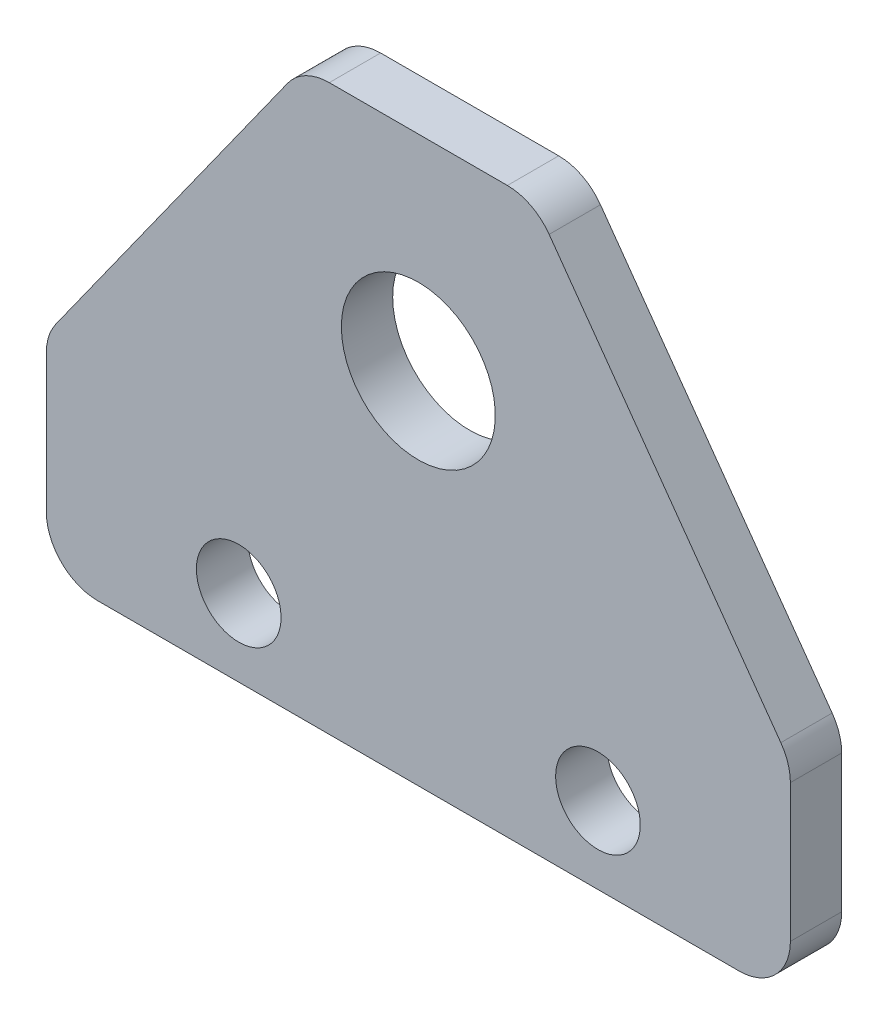
ISO-10303-21;
HEADER;
FILE_DESCRIPTION(('STEP AP214'),'2;1');
FILE_NAME('part.step','',(''),(''),'','','');
FILE_SCHEMA(('AUTOMOTIVE_DESIGN { 1 0 10303 214 1 1 1 1 }'));
ENDSEC;
DATA;
#1=APPLICATION_CONTEXT('core data for automotive mechanical design processes');
#2=APPLICATION_PROTOCOL_DEFINITION('international standard','automotive_design',2000,#1);
#3=PRODUCT_CONTEXT('',#1,'mechanical');
#4=PRODUCT('Part','Part','',(#3));
#5=PRODUCT_RELATED_PRODUCT_CATEGORY('part','',(#4));
#6=PRODUCT_DEFINITION_FORMATION('','',#4);
#7=PRODUCT_DEFINITION_CONTEXT('part definition',#1,'design');
#8=PRODUCT_DEFINITION('design','',#6,#7);
#9=PRODUCT_DEFINITION_SHAPE('','',#8);
#10=(LENGTH_UNIT() NAMED_UNIT(*) SI_UNIT(.MILLI.,.METRE.));
#11=(NAMED_UNIT(*) PLANE_ANGLE_UNIT() SI_UNIT($,.RADIAN.));
#12=(NAMED_UNIT(*) SI_UNIT($,.STERADIAN.) SOLID_ANGLE_UNIT());
#13=UNCERTAINTY_MEASURE_WITH_UNIT(LENGTH_MEASURE(1.E-05),#10,'distance_accuracy_value','');
#14=(GEOMETRIC_REPRESENTATION_CONTEXT(3) GLOBAL_UNCERTAINTY_ASSIGNED_CONTEXT((#13)) GLOBAL_UNIT_ASSIGNED_CONTEXT((#10,
#11,#12)) REPRESENTATION_CONTEXT('',''));
#15=CARTESIAN_POINT('',(0.,0.,0.));
#16=DIRECTION('',(0.,0.,1.));
#17=DIRECTION('',(1.,0.,0.));
#18=AXIS2_PLACEMENT_3D('',#15,#16,#17);
#19=CARTESIAN_POINT('',(72.5,44.0077857544961,10.));
#20=DIRECTION('',(0.,0.,1.));
#21=DIRECTION('',(1.,0.,0.));
#22=AXIS2_PLACEMENT_3D('',#19,#20,#21);
#23=PLANE('',#22);
#24=CARTESIAN_POINT('',(72.5,70.,10.));
#25=DIRECTION('',(0.,0.,-1.));
#26=DIRECTION('',(-1.,0.,0.));
#27=AXIS2_PLACEMENT_3D('',#24,#25,#26);
#28=CIRCLE('',#27,15.);
#29=CARTESIAN_POINT('',(57.5,70.,10.));
#30=VERTEX_POINT('',#29);
#31=EDGE_CURVE('E175',#30,#30,#28,.T.);
#32=ORIENTED_EDGE('',*,*,#31,.T.);
#33=EDGE_LOOP('',(#32));
#34=FACE_BOUND('',#33,.T.);
#35=CARTESIAN_POINT('',(37.5,15.,10.));
#36=DIRECTION('',(0.,0.,-1.));
#37=DIRECTION('',(-1.,0.,0.));
#38=AXIS2_PLACEMENT_3D('',#35,#36,#37);
#39=CIRCLE('',#38,8.25);
#40=CARTESIAN_POINT('',(29.25,15.,10.));
#41=VERTEX_POINT('',#40);
#42=EDGE_CURVE('E178',#41,#41,#39,.T.);
#43=ORIENTED_EDGE('',*,*,#42,.T.);
#44=EDGE_LOOP('',(#43));
#45=FACE_BOUND('',#44,.T.);
#46=CARTESIAN_POINT('',(107.5,15.,10.));
#47=DIRECTION('',(0.,0.,-1.));
#48=DIRECTION('',(-1.,0.,0.));
#49=AXIS2_PLACEMENT_3D('',#46,#47,#48);
#50=CIRCLE('',#49,8.25);
#51=CARTESIAN_POINT('',(99.25,15.,10.));
#52=VERTEX_POINT('',#51);
#53=EDGE_CURVE('E181',#52,#52,#50,.T.);
#54=ORIENTED_EDGE('',*,*,#53,.T.);
#55=EDGE_LOOP('',(#54));
#56=FACE_BOUND('',#55,.T.);
#57=CARTESIAN_POINT('',(9.99999999999999,36.7953494659147,10.));
#58=DIRECTION('',(0.,0.,1.));
#59=DIRECTION('',(1.,0.,0.));
#60=AXIS2_PLACEMENT_3D('',#57,#58,#59);
#61=CIRCLE('',#60,10.);
#62=CARTESIAN_POINT('',(0.,36.7953494659147,10.));
#63=VERTEX_POINT('',#62);
#64=CARTESIAN_POINT('',(1.86266528793265,42.6077314031057,10.));
#65=VERTEX_POINT('',#64);
#66=EDGE_CURVE('E186',#63,#65,#61,.F.);
#67=ORIENTED_EDGE('',*,*,#66,.F.);
#68=DIRECTION('',(0.,-1.,0.));
#69=VECTOR('',#68,1.);
#70=CARTESIAN_POINT('',(0.,40.,10.));
#71=LINE('',#70,#69);
#72=CARTESIAN_POINT('',(0.,10.,10.));
#73=VERTEX_POINT('',#72);
#74=EDGE_CURVE('E130',#73,#63,#71,.F.);
#75=ORIENTED_EDGE('',*,*,#74,.F.);
#76=CARTESIAN_POINT('',(10.,10.,10.));
#77=DIRECTION('',(0.,0.,1.));
#78=DIRECTION('',(1.,0.,0.));
#79=AXIS2_PLACEMENT_3D('',#76,#77,#78);
#80=CIRCLE('',#79,10.);
#81=CARTESIAN_POINT('',(10.,0.,10.));
#82=VERTEX_POINT('',#81);
#83=EDGE_CURVE('E117',#82,#73,#80,.F.);
#84=ORIENTED_EDGE('',*,*,#83,.F.);
#85=DIRECTION('',(1.,0.,0.));
#86=VECTOR('',#85,1.);
#87=CARTESIAN_POINT('',(0.,0.,10.));
#88=LINE('',#87,#86);
#89=CARTESIAN_POINT('',(135.,0.,10.));
#90=VERTEX_POINT('',#89);
#91=EDGE_CURVE('E113',#90,#82,#88,.F.);
#92=ORIENTED_EDGE('',*,*,#91,.F.);
#93=CARTESIAN_POINT('',(135.,10.,10.));
#94=DIRECTION('',(0.,0.,1.));
#95=DIRECTION('',(1.,0.,0.));
#96=AXIS2_PLACEMENT_3D('',#93,#94,#95);
#97=CIRCLE('',#96,10.);
#98=CARTESIAN_POINT('',(145.,10.,10.));
#99=VERTEX_POINT('',#98);
#100=EDGE_CURVE('E20',#99,#90,#97,.F.);
#101=ORIENTED_EDGE('',*,*,#100,.F.);
#102=DIRECTION('',(0.,1.,0.));
#103=VECTOR('',#102,1.);
#104=CARTESIAN_POINT('',(145.,0.,10.));
#105=LINE('',#104,#103);
#106=CARTESIAN_POINT('',(145.,36.7953494659147,10.));
#107=VERTEX_POINT('',#106);
#108=EDGE_CURVE('E126',#107,#99,#105,.F.);
#109=ORIENTED_EDGE('',*,*,#108,.F.);
#110=CARTESIAN_POINT('',(135.,36.7953494659147,10.));
#111=DIRECTION('',(0.,0.,1.));
#112=DIRECTION('',(1.,0.,0.));
#113=AXIS2_PLACEMENT_3D('',#110,#111,#112);
#114=CIRCLE('',#113,10.);
#115=CARTESIAN_POINT('',(143.137334712067,42.6077314031058,10.));
#116=VERTEX_POINT('',#115);
#117=EDGE_CURVE('E147',#116,#107,#114,.F.);
#118=ORIENTED_EDGE('',*,*,#117,.F.);
#119=DIRECTION('',(-0.581238193719096,0.813733471206735,0.));
#120=VECTOR('',#119,1.);
#121=CARTESIAN_POINT('',(145.,40.,10.));
#122=LINE('',#121,#120);
#123=CARTESIAN_POINT('',(97.9911557591493,105.812381937191,10.));
#124=VERTEX_POINT('',#123);
#125=EDGE_CURVE('E142',#124,#116,#122,.F.);
#126=ORIENTED_EDGE('',*,*,#125,.F.);
#127=CARTESIAN_POINT('',(89.8538210470819,100.,10.));
#128=DIRECTION('',(0.,0.,1.));
#129=DIRECTION('',(1.,0.,0.));
#130=AXIS2_PLACEMENT_3D('',#127,#128,#129);
#131=CIRCLE('',#130,10.);
#132=CARTESIAN_POINT('',(89.8538210470819,110.,10.));
#133=VERTEX_POINT('',#132);
#134=EDGE_CURVE('E145',#133,#124,#131,.F.);
#135=ORIENTED_EDGE('',*,*,#134,.F.);
#136=DIRECTION('',(1.,0.,0.));
#137=VECTOR('',#136,1.);
#138=CARTESIAN_POINT('',(95.,110.,10.));
#139=LINE('',#138,#137);
#140=CARTESIAN_POINT('',(55.146178952918,110.,10.));
#141=VERTEX_POINT('',#140);
#142=EDGE_CURVE('E138',#141,#133,#139,.T.);
#143=ORIENTED_EDGE('',*,*,#142,.F.);
#144=CARTESIAN_POINT('',(55.146178952918,100.,10.));
#145=DIRECTION('',(0.,0.,1.));
#146=DIRECTION('',(1.,0.,0.));
#147=AXIS2_PLACEMENT_3D('',#144,#145,#146);
#148=CIRCLE('',#147,10.);
#149=CARTESIAN_POINT('',(47.0088442408507,105.812381937191,10.));
#150=VERTEX_POINT('',#149);
#151=EDGE_CURVE('E188',#150,#141,#148,.F.);
#152=ORIENTED_EDGE('',*,*,#151,.F.);
#153=DIRECTION('',(-0.581238193719096,-0.813733471206735,0.));
#154=VECTOR('',#153,1.);
#155=CARTESIAN_POINT('',(50.,110.,10.));
#156=LINE('',#155,#154);
#157=EDGE_CURVE('E134',#65,#150,#156,.F.);
#158=ORIENTED_EDGE('',*,*,#157,.F.);
#159=EDGE_LOOP('',(#67,#75,#84,#92,#101,#109,#118,#126,#135,#143,#152,#158));
#160=FACE_BOUND('',#159,.T.);
#161=ADVANCED_FACE('F17',(#34,#45,#56,#160),#23,.T.);
#162=CARTESIAN_POINT('',(0.,0.,0.));
#163=DIRECTION('',(0.,-1.,0.));
#164=DIRECTION('',(0.,0.,-1.));
#165=AXIS2_PLACEMENT_3D('',#162,#163,#164);
#166=PLANE('',#165);
#167=DIRECTION('',(0.,0.,1.));
#168=VECTOR('',#167,1.);
#169=CARTESIAN_POINT('',(135.,0.,0.));
#170=LINE('',#169,#168);
#171=CARTESIAN_POINT('',(135.,0.,0.));
#172=VERTEX_POINT('',#171);
#173=EDGE_CURVE('E110',#90,#172,#170,.F.);
#174=ORIENTED_EDGE('',*,*,#173,.F.);
#175=ORIENTED_EDGE('',*,*,#91,.T.);
#176=DIRECTION('',(0.,0.,1.));
#177=VECTOR('',#176,1.);
#178=CARTESIAN_POINT('',(10.,0.,0.));
#179=LINE('',#178,#177);
#180=CARTESIAN_POINT('',(10.,0.,0.));
#181=VERTEX_POINT('',#180);
#182=EDGE_CURVE('E184',#181,#82,#179,.T.);
#183=ORIENTED_EDGE('',*,*,#182,.F.);
#184=DIRECTION('',(1.,0.,0.));
#185=VECTOR('',#184,1.);
#186=CARTESIAN_POINT('',(72.5,0.,0.));
#187=LINE('',#186,#185);
#188=EDGE_CURVE('E124',#181,#172,#187,.T.);
#189=ORIENTED_EDGE('',*,*,#188,.T.);
#190=EDGE_LOOP('',(#174,#175,#183,#189));
#191=FACE_BOUND('',#190,.T.);
#192=ADVANCED_FACE('F123',(#191),#166,.T.);
#193=CARTESIAN_POINT('',(135.,10.,0.));
#194=DIRECTION('',(0.,0.,1.));
#195=DIRECTION('',(1.,0.,0.));
#196=AXIS2_PLACEMENT_3D('',#193,#194,#195);
#197=CYLINDRICAL_SURFACE('',#196,10.);
#198=CARTESIAN_POINT('',(135.,10.,0.));
#199=DIRECTION('',(0.,0.,1.));
#200=DIRECTION('',(1.,0.,0.));
#201=AXIS2_PLACEMENT_3D('',#198,#199,#200);
#202=CIRCLE('',#201,10.);
#203=CARTESIAN_POINT('',(145.,10.,0.));
#204=VERTEX_POINT('',#203);
#205=EDGE_CURVE('E173',#172,#204,#202,.T.);
#206=ORIENTED_EDGE('',*,*,#205,.T.);
#207=DIRECTION('',(0.,0.,-1.));
#208=VECTOR('',#207,1.);
#209=CARTESIAN_POINT('',(145.,10.,0.));
#210=LINE('',#209,#208);
#211=EDGE_CURVE('E112',#99,#204,#210,.T.);
#212=ORIENTED_EDGE('',*,*,#211,.F.);
#213=ORIENTED_EDGE('',*,*,#100,.T.);
#214=ORIENTED_EDGE('',*,*,#173,.T.);
#215=EDGE_LOOP('',(#206,#212,#213,#214));
#216=FACE_BOUND('',#215,.T.);
#217=ADVANCED_FACE('F108',(#216),#197,.T.);
#218=CARTESIAN_POINT('',(145.,0.,0.));
#219=DIRECTION('',(1.,0.,0.));
#220=DIRECTION('',(0.,0.,-1.));
#221=AXIS2_PLACEMENT_3D('',#218,#219,#220);
#222=PLANE('',#221);
#223=DIRECTION('',(0.,0.,1.));
#224=VECTOR('',#223,1.);
#225=CARTESIAN_POINT('',(145.,36.7953494659147,0.));
#226=LINE('',#225,#224);
#227=CARTESIAN_POINT('',(145.,36.7953494659147,0.));
#228=VERTEX_POINT('',#227);
#229=EDGE_CURVE('E190',#107,#228,#226,.F.);
#230=ORIENTED_EDGE('',*,*,#229,.F.);
#231=ORIENTED_EDGE('',*,*,#108,.T.);
#232=ORIENTED_EDGE('',*,*,#211,.T.);
#233=DIRECTION('',(0.,1.,0.));
#234=VECTOR('',#233,1.);
#235=CARTESIAN_POINT('',(145.,44.0077857544961,0.));
#236=LINE('',#235,#234);
#237=EDGE_CURVE('E172',#204,#228,#236,.T.);
#238=ORIENTED_EDGE('',*,*,#237,.T.);
#239=EDGE_LOOP('',(#230,#231,#232,#238));
#240=FACE_BOUND('',#239,.T.);
#241=ADVANCED_FACE('F252',(#240),#222,.T.);
#242=CARTESIAN_POINT('',(135.,36.7953494659147,0.));
#243=DIRECTION('',(0.,0.,1.));
#244=DIRECTION('',(1.,0.,0.));
#245=AXIS2_PLACEMENT_3D('',#242,#243,#244);
#246=CYLINDRICAL_SURFACE('',#245,10.);
#247=CARTESIAN_POINT('',(135.,36.7953494659147,0.));
#248=DIRECTION('',(0.,0.,1.));
#249=DIRECTION('',(1.,0.,0.));
#250=AXIS2_PLACEMENT_3D('',#247,#248,#249);
#251=CIRCLE('',#250,10.);
#252=CARTESIAN_POINT('',(143.137334712067,42.6077314031057,0.));
#253=VERTEX_POINT('',#252);
#254=EDGE_CURVE('E169',#228,#253,#251,.T.);
#255=ORIENTED_EDGE('',*,*,#254,.T.);
#256=DIRECTION('',(0.,0.,1.));
#257=VECTOR('',#256,1.);
#258=CARTESIAN_POINT('',(143.137334712067,42.6077314031059,0.));
#259=LINE('',#258,#257);
#260=EDGE_CURVE('E146',#116,#253,#259,.F.);
#261=ORIENTED_EDGE('',*,*,#260,.F.);
#262=ORIENTED_EDGE('',*,*,#117,.T.);
#263=ORIENTED_EDGE('',*,*,#229,.T.);
#264=EDGE_LOOP('',(#255,#261,#262,#263));
#265=FACE_BOUND('',#264,.T.);
#266=ADVANCED_FACE('F250',(#265),#246,.T.);
#267=CARTESIAN_POINT('',(145.,40.,0.));
#268=DIRECTION('',(0.813733471206735,0.581238193719096,0.));
#269=DIRECTION('',(-0.581238193719096,0.813733471206735,0.));
#270=AXIS2_PLACEMENT_3D('',#267,#268,#269);
#271=PLANE('',#270);
#272=DIRECTION('',(0.,0.,1.));
#273=VECTOR('',#272,1.);
#274=CARTESIAN_POINT('',(97.9911557591492,105.812381937191,0.));
#275=LINE('',#274,#273);
#276=CARTESIAN_POINT('',(97.9911557591493,105.812381937191,0.));
#277=VERTEX_POINT('',#276);
#278=EDGE_CURVE('E141',#124,#277,#275,.F.);
#279=ORIENTED_EDGE('',*,*,#278,.F.);
#280=ORIENTED_EDGE('',*,*,#125,.T.);
#281=ORIENTED_EDGE('',*,*,#260,.T.);
#282=DIRECTION('',(-0.581238193719093,0.813733471206737,0.));
#283=VECTOR('',#282,1.);
#284=CARTESIAN_POINT('',(143.137334712067,42.6077314031057,0.));
#285=LINE('',#284,#283);
#286=EDGE_CURVE('E168',#253,#277,#285,.T.);
#287=ORIENTED_EDGE('',*,*,#286,.T.);
#288=EDGE_LOOP('',(#279,#280,#281,#287));
#289=FACE_BOUND('',#288,.T.);
#290=ADVANCED_FACE('F248',(#289),#271,.T.);
#291=CARTESIAN_POINT('',(89.8538210470819,100.,0.));
#292=DIRECTION('',(0.,0.,1.));
#293=DIRECTION('',(1.,0.,0.));
#294=AXIS2_PLACEMENT_3D('',#291,#292,#293);
#295=CYLINDRICAL_SURFACE('',#294,10.);
#296=CARTESIAN_POINT('',(89.8538210470819,100.,0.));
#297=DIRECTION('',(0.,0.,1.));
#298=DIRECTION('',(1.,0.,0.));
#299=AXIS2_PLACEMENT_3D('',#296,#297,#298);
#300=CIRCLE('',#299,10.);
#301=CARTESIAN_POINT('',(89.8538210470819,110.,0.));
#302=VERTEX_POINT('',#301);
#303=EDGE_CURVE('E165',#277,#302,#300,.T.);
#304=ORIENTED_EDGE('',*,*,#303,.T.);
#305=DIRECTION('',(0.,0.,1.));
#306=VECTOR('',#305,1.);
#307=CARTESIAN_POINT('',(89.8538210470819,110.,0.));
#308=LINE('',#307,#306);
#309=EDGE_CURVE('E140',#133,#302,#308,.F.);
#310=ORIENTED_EDGE('',*,*,#309,.F.);
#311=ORIENTED_EDGE('',*,*,#134,.T.);
#312=ORIENTED_EDGE('',*,*,#278,.T.);
#313=EDGE_LOOP('',(#304,#310,#311,#312));
#314=FACE_BOUND('',#313,.T.);
#315=ADVANCED_FACE('F244',(#314),#295,.T.);
#316=CARTESIAN_POINT('',(95.,110.,0.));
#317=DIRECTION('',(0.,1.,0.));
#318=DIRECTION('',(0.,0.,1.));
#319=AXIS2_PLACEMENT_3D('',#316,#317,#318);
#320=PLANE('',#319);
#321=ORIENTED_EDGE('',*,*,#309,.T.);
#322=DIRECTION('',(1.,0.,0.));
#323=VECTOR('',#322,1.);
#324=CARTESIAN_POINT('',(72.5,110.,0.));
#325=LINE('',#324,#323);
#326=CARTESIAN_POINT('',(55.146178952918,110.,0.));
#327=VERTEX_POINT('',#326);
#328=EDGE_CURVE('E164',#302,#327,#325,.F.);
#329=ORIENTED_EDGE('',*,*,#328,.T.);
#330=DIRECTION('',(0.,0.,1.));
#331=VECTOR('',#330,1.);
#332=CARTESIAN_POINT('',(55.146178952918,110.,0.));
#333=LINE('',#332,#331);
#334=EDGE_CURVE('E137',#141,#327,#333,.F.);
#335=ORIENTED_EDGE('',*,*,#334,.F.);
#336=ORIENTED_EDGE('',*,*,#142,.T.);
#337=EDGE_LOOP('',(#321,#329,#335,#336));
#338=FACE_BOUND('',#337,.T.);
#339=ADVANCED_FACE('F238',(#338),#320,.T.);
#340=CARTESIAN_POINT('',(55.146178952918,100.,0.));
#341=DIRECTION('',(0.,0.,1.));
#342=DIRECTION('',(1.,0.,0.));
#343=AXIS2_PLACEMENT_3D('',#340,#341,#342);
#344=CYLINDRICAL_SURFACE('',#343,10.);
#345=CARTESIAN_POINT('',(55.146178952918,100.,0.));
#346=DIRECTION('',(0.,0.,1.));
#347=DIRECTION('',(1.,0.,0.));
#348=AXIS2_PLACEMENT_3D('',#345,#346,#347);
#349=CIRCLE('',#348,10.);
#350=CARTESIAN_POINT('',(47.0088442408506,105.812381937191,0.));
#351=VERTEX_POINT('',#350);
#352=EDGE_CURVE('E161',#327,#351,#349,.T.);
#353=ORIENTED_EDGE('',*,*,#352,.T.);
#354=DIRECTION('',(0.,0.,1.));
#355=VECTOR('',#354,1.);
#356=CARTESIAN_POINT('',(47.0088442408507,105.812381937191,0.));
#357=LINE('',#356,#355);
#358=EDGE_CURVE('E136',#150,#351,#357,.F.);
#359=ORIENTED_EDGE('',*,*,#358,.F.);
#360=ORIENTED_EDGE('',*,*,#151,.T.);
#361=ORIENTED_EDGE('',*,*,#334,.T.);
#362=EDGE_LOOP('',(#353,#359,#360,#361));
#363=FACE_BOUND('',#362,.T.);
#364=ADVANCED_FACE('F234',(#363),#344,.T.);
#365=CARTESIAN_POINT('',(50.,110.,0.));
#366=DIRECTION('',(-0.813733471206735,0.581238193719096,0.));
#367=DIRECTION('',(-0.581238193719096,-0.813733471206735,0.));
#368=AXIS2_PLACEMENT_3D('',#365,#366,#367);
#369=PLANE('',#368);
#370=ORIENTED_EDGE('',*,*,#358,.T.);
#371=DIRECTION('',(-0.581238193719095,-0.813733471206736,0.));
#372=VECTOR('',#371,1.);
#373=CARTESIAN_POINT('',(47.0088442408506,105.812381937191,0.));
#374=LINE('',#373,#372);
#375=CARTESIAN_POINT('',(1.86266528793264,42.6077314031057,0.));
#376=VERTEX_POINT('',#375);
#377=EDGE_CURVE('E160',#351,#376,#374,.T.);
#378=ORIENTED_EDGE('',*,*,#377,.T.);
#379=DIRECTION('',(0.,0.,1.));
#380=VECTOR('',#379,1.);
#381=CARTESIAN_POINT('',(1.86266528793265,42.6077314031057,0.));
#382=LINE('',#381,#380);
#383=EDGE_CURVE('E133',#65,#376,#382,.F.);
#384=ORIENTED_EDGE('',*,*,#383,.F.);
#385=ORIENTED_EDGE('',*,*,#157,.T.);
#386=EDGE_LOOP('',(#370,#378,#384,#385));
#387=FACE_BOUND('',#386,.T.);
#388=ADVANCED_FACE('F228',(#387),#369,.T.);
#389=CARTESIAN_POINT('',(9.99999999999999,36.7953494659147,0.));
#390=DIRECTION('',(0.,0.,1.));
#391=DIRECTION('',(1.,0.,0.));
#392=AXIS2_PLACEMENT_3D('',#389,#390,#391);
#393=CYLINDRICAL_SURFACE('',#392,10.);
#394=CARTESIAN_POINT('',(9.99999999999999,36.7953494659147,0.));
#395=DIRECTION('',(0.,0.,1.));
#396=DIRECTION('',(1.,0.,0.));
#397=AXIS2_PLACEMENT_3D('',#394,#395,#396);
#398=CIRCLE('',#397,10.);
#399=CARTESIAN_POINT('',(0.,36.7953494659147,0.));
#400=VERTEX_POINT('',#399);
#401=EDGE_CURVE('E157',#376,#400,#398,.T.);
#402=ORIENTED_EDGE('',*,*,#401,.T.);
#403=DIRECTION('',(0.,0.,1.));
#404=VECTOR('',#403,1.);
#405=CARTESIAN_POINT('',(0.,36.7953494659147,0.));
#406=LINE('',#405,#404);
#407=EDGE_CURVE('E132',#63,#400,#406,.F.);
#408=ORIENTED_EDGE('',*,*,#407,.F.);
#409=ORIENTED_EDGE('',*,*,#66,.T.);
#410=ORIENTED_EDGE('',*,*,#383,.T.);
#411=EDGE_LOOP('',(#402,#408,#409,#410));
#412=FACE_BOUND('',#411,.T.);
#413=ADVANCED_FACE('F224',(#412),#393,.T.);
#414=CARTESIAN_POINT('',(0.,40.,0.));
#415=DIRECTION('',(-1.,0.,0.));
#416=DIRECTION('',(0.,-1.,0.));
#417=AXIS2_PLACEMENT_3D('',#414,#415,#416);
#418=PLANE('',#417);
#419=ORIENTED_EDGE('',*,*,#407,.T.);
#420=DIRECTION('',(0.,1.,0.));
#421=VECTOR('',#420,1.);
#422=CARTESIAN_POINT('',(0.,44.0077857544961,0.));
#423=LINE('',#422,#421);
#424=CARTESIAN_POINT('',(0.,10.,0.));
#425=VERTEX_POINT('',#424);
#426=EDGE_CURVE('E156',#400,#425,#423,.F.);
#427=ORIENTED_EDGE('',*,*,#426,.T.);
#428=DIRECTION('',(0.,0.,1.));
#429=VECTOR('',#428,1.);
#430=CARTESIAN_POINT('',(0.,10.,0.));
#431=LINE('',#430,#429);
#432=EDGE_CURVE('E35',#73,#425,#431,.F.);
#433=ORIENTED_EDGE('',*,*,#432,.F.);
#434=ORIENTED_EDGE('',*,*,#74,.T.);
#435=EDGE_LOOP('',(#419,#427,#433,#434));
#436=FACE_BOUND('',#435,.T.);
#437=ADVANCED_FACE('F217',(#436),#418,.T.);
#438=CARTESIAN_POINT('',(10.,10.,0.));
#439=DIRECTION('',(0.,0.,1.));
#440=DIRECTION('',(1.,0.,0.));
#441=AXIS2_PLACEMENT_3D('',#438,#439,#440);
#442=CYLINDRICAL_SURFACE('',#441,10.);
#443=CARTESIAN_POINT('',(10.,10.,0.));
#444=DIRECTION('',(0.,0.,1.));
#445=DIRECTION('',(1.,0.,0.));
#446=AXIS2_PLACEMENT_3D('',#443,#444,#445);
#447=CIRCLE('',#446,10.);
#448=EDGE_CURVE('E154',#425,#181,#447,.T.);
#449=ORIENTED_EDGE('',*,*,#448,.T.);
#450=ORIENTED_EDGE('',*,*,#182,.T.);
#451=ORIENTED_EDGE('',*,*,#83,.T.);
#452=ORIENTED_EDGE('',*,*,#432,.T.);
#453=EDGE_LOOP('',(#449,#450,#451,#452));
#454=FACE_BOUND('',#453,.T.);
#455=ADVANCED_FACE('F281',(#454),#442,.T.);
#456=CARTESIAN_POINT('',(107.5,15.,10.));
#457=DIRECTION('',(0.,0.,-1.));
#458=DIRECTION('',(-1.,0.,0.));
#459=AXIS2_PLACEMENT_3D('',#456,#457,#458);
#460=CYLINDRICAL_SURFACE('',#459,8.25);
#461=ORIENTED_EDGE('',*,*,#53,.F.);
#462=EDGE_LOOP('',(#461));
#463=FACE_BOUND('',#462,.T.);
#464=CARTESIAN_POINT('',(107.5,15.,0.));
#465=DIRECTION('',(0.,0.,-1.));
#466=DIRECTION('',(-1.,0.,0.));
#467=AXIS2_PLACEMENT_3D('',#464,#465,#466);
#468=CIRCLE('',#467,8.25);
#469=CARTESIAN_POINT('',(99.25,15.,0.));
#470=VERTEX_POINT('',#469);
#471=EDGE_CURVE('E151',#470,#470,#468,.T.);
#472=ORIENTED_EDGE('',*,*,#471,.T.);
#473=EDGE_LOOP('',(#472));
#474=FACE_BOUND('',#473,.T.);
#475=ADVANCED_FACE('F277',(#463,#474),#460,.F.);
#476=CARTESIAN_POINT('',(37.5,15.,10.));
#477=DIRECTION('',(0.,0.,-1.));
#478=DIRECTION('',(-1.,0.,0.));
#479=AXIS2_PLACEMENT_3D('',#476,#477,#478);
#480=CYLINDRICAL_SURFACE('',#479,8.25);
#481=ORIENTED_EDGE('',*,*,#42,.F.);
#482=EDGE_LOOP('',(#481));
#483=FACE_BOUND('',#482,.T.);
#484=CARTESIAN_POINT('',(37.5,15.,0.));
#485=DIRECTION('',(0.,0.,-1.));
#486=DIRECTION('',(-1.,0.,0.));
#487=AXIS2_PLACEMENT_3D('',#484,#485,#486);
#488=CIRCLE('',#487,8.25);
#489=CARTESIAN_POINT('',(29.25,15.,0.));
#490=VERTEX_POINT('',#489);
#491=EDGE_CURVE('E26',#490,#490,#488,.T.);
#492=ORIENTED_EDGE('',*,*,#491,.T.);
#493=EDGE_LOOP('',(#492));
#494=FACE_BOUND('',#493,.T.);
#495=ADVANCED_FACE('F269',(#483,#494),#480,.F.);
#496=CARTESIAN_POINT('',(72.5,70.,10.));
#497=DIRECTION('',(0.,0.,-1.));
#498=DIRECTION('',(-1.,0.,0.));
#499=AXIS2_PLACEMENT_3D('',#496,#497,#498);
#500=CYLINDRICAL_SURFACE('',#499,15.);
#501=ORIENTED_EDGE('',*,*,#31,.F.);
#502=EDGE_LOOP('',(#501));
#503=FACE_BOUND('',#502,.T.);
#504=CARTESIAN_POINT('',(72.5,70.,0.));
#505=DIRECTION('',(0.,0.,-1.));
#506=DIRECTION('',(-1.,0.,0.));
#507=AXIS2_PLACEMENT_3D('',#504,#505,#506);
#508=CIRCLE('',#507,15.);
#509=CARTESIAN_POINT('',(57.5,70.,0.));
#510=VERTEX_POINT('',#509);
#511=EDGE_CURVE('E11',#510,#510,#508,.T.);
#512=ORIENTED_EDGE('',*,*,#511,.T.);
#513=EDGE_LOOP('',(#512));
#514=FACE_BOUND('',#513,.T.);
#515=ADVANCED_FACE('F263',(#503,#514),#500,.F.);
#516=CARTESIAN_POINT('',(72.5,44.0077857544961,0.));
#517=DIRECTION('',(0.,0.,1.));
#518=DIRECTION('',(1.,0.,0.));
#519=AXIS2_PLACEMENT_3D('',#516,#517,#518);
#520=PLANE('',#519);
#521=ORIENTED_EDGE('',*,*,#511,.F.);
#522=EDGE_LOOP('',(#521));
#523=FACE_BOUND('',#522,.T.);
#524=ORIENTED_EDGE('',*,*,#491,.F.);
#525=EDGE_LOOP('',(#524));
#526=FACE_BOUND('',#525,.T.);
#527=ORIENTED_EDGE('',*,*,#471,.F.);
#528=EDGE_LOOP('',(#527));
#529=FACE_BOUND('',#528,.T.);
#530=ORIENTED_EDGE('',*,*,#426,.F.);
#531=ORIENTED_EDGE('',*,*,#401,.F.);
#532=ORIENTED_EDGE('',*,*,#377,.F.);
#533=ORIENTED_EDGE('',*,*,#352,.F.);
#534=ORIENTED_EDGE('',*,*,#328,.F.);
#535=ORIENTED_EDGE('',*,*,#303,.F.);
#536=ORIENTED_EDGE('',*,*,#286,.F.);
#537=ORIENTED_EDGE('',*,*,#254,.F.);
#538=ORIENTED_EDGE('',*,*,#237,.F.);
#539=ORIENTED_EDGE('',*,*,#205,.F.);
#540=ORIENTED_EDGE('',*,*,#188,.F.);
#541=ORIENTED_EDGE('',*,*,#448,.F.);
#542=EDGE_LOOP('',(#530,#531,#532,#533,#534,#535,#536,#537,#538,#539,#540,#541));
#543=FACE_BOUND('',#542,.T.);
#544=ADVANCED_FACE('F221',(#523,#526,#529,#543),#520,.F.);
#545=CLOSED_SHELL('',(#161,#192,#217,#241,#266,#290,#315,#339,#364,#388,#413,#437,#455,#475,
#495,#515,#544));
#546=MANIFOLD_SOLID_BREP('B1',#545);
#547=ADVANCED_BREP_SHAPE_REPRESENTATION('',(#18,#546),#14);
#548=SHAPE_DEFINITION_REPRESENTATION(#9,#547);
ENDSEC;
END-ISO-10303-21;
